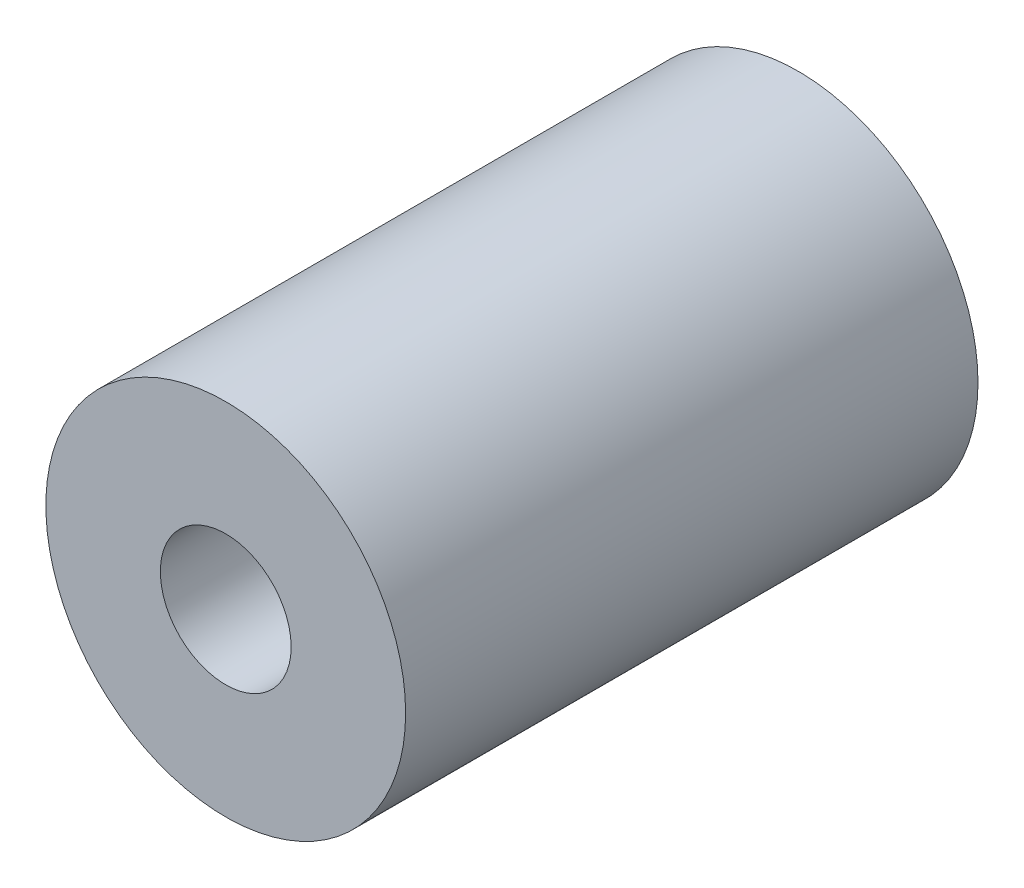
ISO-10303-21;
HEADER;
FILE_DESCRIPTION(('STEP AP214'),'2;1');
FILE_NAME('part.step','',(''),(''),'','','');
FILE_SCHEMA(('AUTOMOTIVE_DESIGN { 1 0 10303 214 1 1 1 1 }'));
ENDSEC;
DATA;
#1=APPLICATION_CONTEXT('core data for automotive mechanical design processes');
#2=APPLICATION_PROTOCOL_DEFINITION('international standard','automotive_design',2000,#1);
#3=PRODUCT_CONTEXT('',#1,'mechanical');
#4=PRODUCT('Part','Part','',(#3));
#5=PRODUCT_RELATED_PRODUCT_CATEGORY('part','',(#4));
#6=PRODUCT_DEFINITION_FORMATION('','',#4);
#7=PRODUCT_DEFINITION_CONTEXT('part definition',#1,'design');
#8=PRODUCT_DEFINITION('design','',#6,#7);
#9=PRODUCT_DEFINITION_SHAPE('','',#8);
#10=(LENGTH_UNIT() NAMED_UNIT(*) SI_UNIT(.MILLI.,.METRE.));
#11=(NAMED_UNIT(*) PLANE_ANGLE_UNIT() SI_UNIT($,.RADIAN.));
#12=(NAMED_UNIT(*) SI_UNIT($,.STERADIAN.) SOLID_ANGLE_UNIT());
#13=UNCERTAINTY_MEASURE_WITH_UNIT(LENGTH_MEASURE(1.E-05),#10,'distance_accuracy_value','');
#14=(GEOMETRIC_REPRESENTATION_CONTEXT(3) GLOBAL_UNCERTAINTY_ASSIGNED_CONTEXT((#13)) GLOBAL_UNIT_ASSIGNED_CONTEXT((#10,
#11,#12)) REPRESENTATION_CONTEXT('',''));
#15=CARTESIAN_POINT('',(0.,0.,0.));
#16=DIRECTION('',(0.,0.,1.));
#17=DIRECTION('',(1.,0.,0.));
#18=AXIS2_PLACEMENT_3D('',#15,#16,#17);
#19=CARTESIAN_POINT('',(0.,0.,35.));
#20=DIRECTION('',(0.,0.,-1.));
#21=DIRECTION('',(-1.,0.,0.));
#22=AXIS2_PLACEMENT_3D('',#19,#20,#21);
#23=CYLINDRICAL_SURFACE('',#22,11.);
#24=CARTESIAN_POINT('',(0.,-11.,30.0344309503601));
#25=CARTESIAN_POINT('',(0.111357271644373,-10.9999980072786,30.0344266316994));
#26=CARTESIAN_POINT('',(0.222771449918202,-10.9982915273343,30.0250991928774));
#27=CARTESIAN_POINT('',(0.442464406848309,-10.99164847502,29.9880574843352));
#28=CARTESIAN_POINT('',(0.550740387266074,-10.9867091072254,29.9603273017787));
#29=CARTESIAN_POINT('',(0.760947572513748,-10.9741532323507,29.8873538206891));
#30=CARTESIAN_POINT('',(0.862884263930177,-10.9665390793192,29.8421259181703));
#31=CARTESIAN_POINT('',(1.0577120033845,-10.949466714983,29.7354836191683));
#32=CARTESIAN_POINT('',(1.15060386767905,-10.9400086703132,29.6740706851719));
#33=CARTESIAN_POINT('',(1.32576444051238,-10.9201743349983,29.5360650407174));
#34=CARTESIAN_POINT('',(1.40791622603346,-10.9097897259708,29.4593251083793));
#35=CARTESIAN_POINT('',(1.55825357341079,-10.8893349521181,29.2931605962702));
#36=CARTESIAN_POINT('',(1.62643816794977,-10.8792648091126,29.2037351386709));
#37=CARTESIAN_POINT('',(1.74738695016477,-10.8604984020977,29.0139182209003));
#38=CARTESIAN_POINT('',(1.80003313265556,-10.851812871101,28.9134504151297));
#39=CARTESIAN_POINT('',(1.88765546949978,-10.836915832769,28.7049123000361));
#40=CARTESIAN_POINT('',(1.92263305283275,-10.8307041253674,28.596842606335));
#41=CARTESIAN_POINT('',(1.97355197711315,-10.8215415351671,28.3774163010035));
#42=CARTESIAN_POINT('',(1.98969666425445,-10.8185558462234,28.2661083586505));
#43=CARTESIAN_POINT('',(2.00312248736688,-10.8160783143231,28.0423265430455));
#44=CARTESIAN_POINT('',(2.00040521296643,-10.8165861769405,27.929852768844));
#45=CARTESIAN_POINT('',(1.97634934427,-10.8210066504918,27.7083990362271));
#46=CARTESIAN_POINT('',(1.95524117699072,-10.8248771281426,27.5993930824644));
#47=CARTESIAN_POINT('',(1.89536523340027,-10.8355206127391,27.3864959319929));
#48=CARTESIAN_POINT('',(1.85659674743188,-10.8422937363232,27.2826049410083));
#49=CARTESIAN_POINT('',(1.76227297789296,-10.8580238155271,27.0822081595813));
#50=CARTESIAN_POINT('',(1.7066239037154,-10.8669929171435,26.985747507694));
#51=CARTESIAN_POINT('',(1.58018503374043,-10.8860962201172,26.8034462134148));
#52=CARTESIAN_POINT('',(1.50939379023585,-10.8962305328347,26.7176065877138));
#53=CARTESIAN_POINT('',(1.35343399418352,-10.9167064080854,26.5576519539157));
#54=CARTESIAN_POINT('',(1.2680681726569,-10.9270488181647,26.4837292619232));
#55=CARTESIAN_POINT('',(1.08604454069331,-10.9466375043709,26.3512258168792));
#56=CARTESIAN_POINT('',(0.989386629498159,-10.9558837707156,26.2926452007388));
#57=CARTESIAN_POINT('',(0.787327598497298,-10.9722553782534,26.192463560575));
#58=CARTESIAN_POINT('',(0.681916780395493,-10.9793783255922,26.1508816816641));
#59=CARTESIAN_POINT('',(0.465448414462666,-10.9906820547088,26.0860677578664));
#60=CARTESIAN_POINT('',(0.354391431316064,-10.994863130091,26.0628338817862));
#61=CARTESIAN_POINT('',(0.131438649578499,-10.9997719337866,26.035641188441));
#62=CARTESIAN_POINT('',(0.0195760121089342,-11.0005468934114,26.031418726906));
#63=CARTESIAN_POINT('',(-0.203257238970967,-10.998686302475,26.0416627485416));
#64=CARTESIAN_POINT('',(-0.314227893453081,-10.9960509090871,26.0561283704318));
#65=CARTESIAN_POINT('',(-0.531297097592757,-10.9876950863245,26.1031186999219));
#66=CARTESIAN_POINT('',(-0.637425297458317,-10.9819973157216,26.1355108195429));
#67=CARTESIAN_POINT('',(-0.84274471375661,-10.9681529512222,26.217291778882));
#68=CARTESIAN_POINT('',(-0.941935480960949,-10.9600061989243,26.2666817180578));
#69=CARTESIAN_POINT('',(-1.13169524707493,-10.9420497958484,26.381645588163));
#70=CARTESIAN_POINT('',(-1.22216445208488,-10.932223816146,26.447381637516));
#71=CARTESIAN_POINT('',(-1.39088213822347,-10.9120428807108,26.5929513270312));
#72=CARTESIAN_POINT('',(-1.46912954974332,-10.901687878785,26.672786199772));
#73=CARTESIAN_POINT('',(-1.6121773788768,-10.8814603955764,26.8454778318086));
#74=CARTESIAN_POINT('',(-1.67679836741418,-10.8715955212189,26.9384842568859));
#75=CARTESIAN_POINT('',(-1.78949986552014,-10.8536151008102,27.1341871317666));
#76=CARTESIAN_POINT('',(-1.83758096630795,-10.8454994922354,27.2368832350445));
#77=CARTESIAN_POINT('',(-1.91557945241746,-10.8319954461548,27.4485817000518));
#78=CARTESIAN_POINT('',(-1.9455810786184,-10.8265943801675,27.5575521810981));
#79=CARTESIAN_POINT('',(-1.98683040178554,-10.8191012654539,27.7790939389911));
#80=CARTESIAN_POINT('',(-1.99808007453629,-10.8170088681136,27.891664835209));
#81=CARTESIAN_POINT('',(-2.00144313663184,-10.8163869388262,28.1154163258237));
#82=CARTESIAN_POINT('',(-1.99383937001232,-10.8178047454411,28.2265926217986));
#83=CARTESIAN_POINT('',(-1.96032846912815,-10.8239270874703,28.4460545883775));
#84=CARTESIAN_POINT('',(-1.93442142905718,-10.8286316059701,28.5543402738544));
#85=CARTESIAN_POINT('',(-1.86515567158477,-10.8407757208091,28.7648071477554));
#86=CARTESIAN_POINT('',(-1.82182581019232,-10.8482107929975,28.8669981105835));
#87=CARTESIAN_POINT('',(-1.71897473664823,-10.8649817751485,29.0627053975248));
#88=CARTESIAN_POINT('',(-1.65945247569007,-10.8743178082294,29.1562211592057));
#89=CARTESIAN_POINT('',(-1.52491543662799,-10.8940032465146,29.3333438249557));
#90=CARTESIAN_POINT('',(-1.44969415553099,-10.9043650783111,29.4167925202308));
#91=CARTESIAN_POINT('',(-1.28632651423364,-10.9248399206865,29.5699780313723));
#92=CARTESIAN_POINT('',(-1.19817718680093,-10.9349528735191,29.6397116907523));
#93=CARTESIAN_POINT('',(-1.0105711896463,-10.9538897429719,29.7640312474836));
#94=CARTESIAN_POINT('',(-0.911025849790497,-10.9627021317343,29.8184851355402));
#95=CARTESIAN_POINT('',(-0.704073905086345,-10.9779326099335,29.9098101664341));
#96=CARTESIAN_POINT('',(-0.59667492548667,-10.9843529858473,29.9466981096384));
#97=CARTESIAN_POINT('',(-0.407441749458405,-10.9927407037649,29.9942063806623));
#98=CARTESIAN_POINT('',(-0.32672542727649,-10.9954478027358,30.0092652833204));
#99=CARTESIAN_POINT('',(-0.164016342132203,-10.9990781643304,30.029379044155));
#100=CARTESIAN_POINT('',(-0.0820236084408332,-11.0000014678,30.0344341314018));
#101=CARTESIAN_POINT('',(0.,-11.,30.0344309503601));
#102=B_SPLINE_CURVE_WITH_KNOTS('',3,(#24,#25,#26,#27,#28,#29,#30,#31,#32,#33,#34,#35,#36,#37,
#38,#39,#40,#41,#42,#43,#44,#45,#46,#47,#48,#49,#50,#51,#52,#53,#54,#55,#56,#57,#58,#59,#60,#61,
#62,#63,#64,#65,#66,#67,#68,#69,#70,#71,#72,#73,#74,#75,#76,#77,#78,#79,#80,#81,#82,#83,#84,#85,
#86,#87,#88,#89,#90,#91,#92,#93,#94,#95,#96,#97,#98,#99,#100,#101),.UNSPECIFIED.,.T.,.F.,(4,2,2,
2,2,2,2,2,2,2,2,2,2,2,2,2,2,2,2,2,2,2,2,2,2,2,2,2,2,2,2,2,2,2,2,2,2,2,4),(0.,0.333771891552332,
0.66783277207259,1.00160038286675,1.3353378446015,1.67245014596885,2.00958578663078,
2.3492195220365,2.6888257845573,3.02473021172645,3.36060633024202,3.69233367290895,
4.02407434678871,4.35769306461625,4.69134369321255,5.02993210441872,5.36852353704646,
5.70749527023812,6.04643316861453,6.38065600997364,6.71486344850797,7.0466314328543,
7.37842088074221,7.71364226795666,8.04889297616123,8.38831506130459,8.72772501252475,
9.06554101076157,9.40332141303601,9.73606509730371,10.0688070691931,10.4010002025896,
10.733214857769,11.0701111453004,11.4070848782946,11.7468860454293,12.0863615649817,
12.3322171022956,12.5780670098676),.UNSPECIFIED.);
#103=CARTESIAN_POINT('',(0.,-11.,30.0344309503601));
#104=VERTEX_POINT('',#103);
#105=EDGE_CURVE('E58',#104,#104,#102,.T.);
#106=ORIENTED_EDGE('',*,*,#105,.T.);
#107=EDGE_LOOP('',(#106));
#108=FACE_BOUND('',#107,.T.);
#109=CARTESIAN_POINT('',(0.,-11.,8.7636310761506));
#110=CARTESIAN_POINT('',(0.111357271644373,-10.9999980072786,8.76362675748993));
#111=CARTESIAN_POINT('',(0.222771449918202,-10.9982915273343,8.75429931866795));
#112=CARTESIAN_POINT('',(0.442464406848309,-10.99164847502,8.71725761012568));
#113=CARTESIAN_POINT('',(0.550740387266074,-10.9867091072254,8.68952742756923));
#114=CARTESIAN_POINT('',(0.760947572513747,-10.9741532323507,8.61655394647962));
#115=CARTESIAN_POINT('',(0.862884263930176,-10.9665390793192,8.57132604396084));
#116=CARTESIAN_POINT('',(1.0577120033845,-10.949466714983,8.46468374495882));
#117=CARTESIAN_POINT('',(1.15060386767904,-10.9400086703132,8.40327081096241));
#118=CARTESIAN_POINT('',(1.32576444051238,-10.9201743349983,8.2652651665079));
#119=CARTESIAN_POINT('',(1.40791622603346,-10.9097897259708,8.18852523416984));
#120=CARTESIAN_POINT('',(1.55825357341079,-10.8893349521181,8.02236072206078));
#121=CARTESIAN_POINT('',(1.62643816794977,-10.8792648091126,7.93293526446146));
#122=CARTESIAN_POINT('',(1.74738695016477,-10.8604984020977,7.74311834669083));
#123=CARTESIAN_POINT('',(1.80003313265556,-10.851812871101,7.64265054092023));
#124=CARTESIAN_POINT('',(1.88765546949978,-10.836915832769,7.43411242582664));
#125=CARTESIAN_POINT('',(1.92263305283275,-10.8307041253674,7.32604273212557));
#126=CARTESIAN_POINT('',(1.97355197711315,-10.8215415351671,7.10661642679401));
#127=CARTESIAN_POINT('',(1.98969666425445,-10.8185558462234,6.99530848444098));
#128=CARTESIAN_POINT('',(2.00312248736688,-10.8160783143231,6.77152666883604));
#129=CARTESIAN_POINT('',(2.00040521296643,-10.8165861769405,6.65905289463457));
#130=CARTESIAN_POINT('',(1.97634934427,-10.8210066504918,6.43759916201759));
#131=CARTESIAN_POINT('',(1.95524117699072,-10.8248771281426,6.32859320825488));
#132=CARTESIAN_POINT('',(1.89536523340026,-10.8355206127391,6.11569605778344));
#133=CARTESIAN_POINT('',(1.85659674743188,-10.8422937363232,6.01180506679882));
#134=CARTESIAN_POINT('',(1.76227297789295,-10.8580238155272,5.81140828537187));
#135=CARTESIAN_POINT('',(1.7066239037154,-10.8669929171435,5.71494763348448));
#136=CARTESIAN_POINT('',(1.58018503374043,-10.8860962201172,5.53264633920531));
#137=CARTESIAN_POINT('',(1.50939379023584,-10.8962305328347,5.44680671350437));
#138=CARTESIAN_POINT('',(1.35343399418352,-10.9167064080854,5.28685207970623));
#139=CARTESIAN_POINT('',(1.2680681726569,-10.9270488181647,5.21292938771369));
#140=CARTESIAN_POINT('',(1.08604454069331,-10.9466375043709,5.08042594266977));
#141=CARTESIAN_POINT('',(0.989386629498158,-10.9558837707156,5.02184532652934));
#142=CARTESIAN_POINT('',(0.787327598497297,-10.9722553782534,4.92166368636558));
#143=CARTESIAN_POINT('',(0.681916780395493,-10.9793783255922,4.88008180745463));
#144=CARTESIAN_POINT('',(0.465448414462668,-10.9906820547088,4.8152678836569));
#145=CARTESIAN_POINT('',(0.354391431316066,-10.994863130091,4.79203400757669));
#146=CARTESIAN_POINT('',(0.1314386495785,-10.9997719337866,4.76484131423148));
#147=CARTESIAN_POINT('',(0.019576012108935,-11.0005468934114,4.76061885269652));
#148=CARTESIAN_POINT('',(-0.203257238970966,-10.998686302475,4.7708628743321));
#149=CARTESIAN_POINT('',(-0.314227893453081,-10.9960509090871,4.78532849622235));
#150=CARTESIAN_POINT('',(-0.531297097592756,-10.9876950863245,4.83231882571248));
#151=CARTESIAN_POINT('',(-0.637425297458316,-10.9819973157216,4.86471094533343));
#152=CARTESIAN_POINT('',(-0.842744713756609,-10.9681529512222,4.94649190467254));
#153=CARTESIAN_POINT('',(-0.941935480960948,-10.9600061989243,4.9958818438483));
#154=CARTESIAN_POINT('',(-1.13169524707493,-10.9420497958484,5.11084571395353));
#155=CARTESIAN_POINT('',(-1.22216445208488,-10.932223816146,5.17658176330653));
#156=CARTESIAN_POINT('',(-1.39088213822347,-10.9120428807108,5.3221514528217));
#157=CARTESIAN_POINT('',(-1.46912954974332,-10.901687878785,5.40198632556254));
#158=CARTESIAN_POINT('',(-1.6121773788768,-10.8814603955764,5.5746779575991));
#159=CARTESIAN_POINT('',(-1.67679836741418,-10.8715955212189,5.66768438267647));
#160=CARTESIAN_POINT('',(-1.78949986552014,-10.8536151008102,5.86338725755709));
#161=CARTESIAN_POINT('',(-1.83758096630795,-10.8454994922354,5.96608336083499));
#162=CARTESIAN_POINT('',(-1.91557945241746,-10.8319954461548,6.17778182584235));
#163=CARTESIAN_POINT('',(-1.9455810786184,-10.8265943801675,6.28675230688866));
#164=CARTESIAN_POINT('',(-1.98683040178554,-10.8191012654539,6.50829406478167));
#165=CARTESIAN_POINT('',(-1.99808007453629,-10.8170088681136,6.62086496099953));
#166=CARTESIAN_POINT('',(-2.00144313663184,-10.8163869388262,6.84461645161424));
#167=CARTESIAN_POINT('',(-1.99383937001232,-10.8178047454411,6.95579274758914));
#168=CARTESIAN_POINT('',(-1.96032846912815,-10.8239270874703,7.17525471416802));
#169=CARTESIAN_POINT('',(-1.93442142905718,-10.8286316059701,7.28354039964489));
#170=CARTESIAN_POINT('',(-1.86515567158476,-10.8407757208091,7.49400727354597));
#171=CARTESIAN_POINT('',(-1.82182581019232,-10.8482107929975,7.59619823637404));
#172=CARTESIAN_POINT('',(-1.71897473664823,-10.8649817751485,7.79190552331534));
#173=CARTESIAN_POINT('',(-1.65945247569007,-10.8743178082294,7.88542128499619));
#174=CARTESIAN_POINT('',(-1.52491543662799,-10.8940032465146,8.06254395074623));
#175=CARTESIAN_POINT('',(-1.44969415553099,-10.9043650783111,8.14599264602137));
#176=CARTESIAN_POINT('',(-1.28632651423364,-10.9248399206865,8.2991781571628));
#177=CARTESIAN_POINT('',(-1.19817718680093,-10.9349528735191,8.36891181654285));
#178=CARTESIAN_POINT('',(-1.0105711896463,-10.9538897429719,8.49323137327409));
#179=CARTESIAN_POINT('',(-0.911025849790496,-10.9627021317343,8.54768526133073));
#180=CARTESIAN_POINT('',(-0.704073905086344,-10.9779326099335,8.63901029222466));
#181=CARTESIAN_POINT('',(-0.59667492548667,-10.9843529858473,8.67589823542892));
#182=CARTESIAN_POINT('',(-0.407441749458405,-10.9927407037649,8.7234065064528));
#183=CARTESIAN_POINT('',(-0.326725427276489,-10.9954478027358,8.73846540911096));
#184=CARTESIAN_POINT('',(-0.164016342132202,-10.9990781643304,8.7585791699455));
#185=CARTESIAN_POINT('',(-0.0820236084408327,-11.0000014678,8.76363425719237));
#186=CARTESIAN_POINT('',(0.,-11.,8.7636310761506));
#187=B_SPLINE_CURVE_WITH_KNOTS('',3,(#109,#110,#111,#112,#113,#114,#115,#116,#117,#118,#119,
#120,#121,#122,#123,#124,#125,#126,#127,#128,#129,#130,#131,#132,#133,#134,#135,#136,#137,#138,
#139,#140,#141,#142,#143,#144,#145,#146,#147,#148,#149,#150,#151,#152,#153,#154,#155,#156,#157,
#158,#159,#160,#161,#162,#163,#164,#165,#166,#167,#168,#169,#170,#171,#172,#173,#174,#175,#176,
#177,#178,#179,#180,#181,#182,#183,#184,#185,#186),.UNSPECIFIED.,.T.,.F.,(4,2,2,2,2,2,2,2,2,2,2,
2,2,2,2,2,2,2,2,2,2,2,2,2,2,2,2,2,2,2,2,2,2,2,2,2,2,2,4),(0.,0.333771891552332,
0.667832772072589,1.00160038286674,1.3353378446015,1.67245014596885,2.00958578663078,
2.3492195220365,2.6888257845573,3.02473021172645,3.36060633024202,3.69233367290895,
4.02407434678871,4.35769306461625,4.69134369321255,5.02993210441872,5.36852353704646,
5.70749527023812,6.04643316861453,6.38065600997364,6.71486344850797,7.0466314328543,
7.3784208807422,7.71364226795666,8.04889297616123,8.38831506130459,8.72772501252475,
9.06554101076157,9.40332141303602,9.73606509730371,10.0688070691931,10.4010002025896,
10.733214857769,11.0701111453004,11.4070848782946,11.7468860454293,12.0863615649817,
12.3322171022956,12.5780670098676),.UNSPECIFIED.);
#188=CARTESIAN_POINT('',(0.,-11.,8.7636310761506));
#189=VERTEX_POINT('',#188);
#190=EDGE_CURVE('E57',#189,#189,#187,.T.);
#191=ORIENTED_EDGE('',*,*,#190,.T.);
#192=EDGE_LOOP('',(#191));
#193=FACE_BOUND('',#192,.T.);
#194=CARTESIAN_POINT('',(0.,0.,35.));
#195=DIRECTION('',(0.,0.,1.));
#196=DIRECTION('',(1.,0.,0.));
#197=AXIS2_PLACEMENT_3D('',#194,#195,#196);
#198=CIRCLE('',#197,11.);
#199=CARTESIAN_POINT('',(11.,0.,35.));
#200=VERTEX_POINT('',#199);
#201=EDGE_CURVE('E10',#200,#200,#198,.T.);
#202=ORIENTED_EDGE('',*,*,#201,.F.);
#203=EDGE_LOOP('',(#202));
#204=FACE_BOUND('',#203,.T.);
#205=CARTESIAN_POINT('',(0.,0.,0.));
#206=DIRECTION('',(0.,0.,1.));
#207=DIRECTION('',(1.,0.,0.));
#208=AXIS2_PLACEMENT_3D('',#205,#206,#207);
#209=CIRCLE('',#208,11.);
#210=CARTESIAN_POINT('',(11.,0.,0.));
#211=VERTEX_POINT('',#210);
#212=EDGE_CURVE('E42',#211,#211,#209,.T.);
#213=ORIENTED_EDGE('',*,*,#212,.T.);
#214=EDGE_LOOP('',(#213));
#215=FACE_BOUND('',#214,.T.);
#216=ADVANCED_FACE('F30',(#108,#193,#204,#215),#23,.T.);
#217=CARTESIAN_POINT('',(0.,0.,35.));
#218=DIRECTION('',(0.,0.,1.));
#219=DIRECTION('',(1.,0.,0.));
#220=AXIS2_PLACEMENT_3D('',#217,#218,#219);
#221=PLANE('',#220);
#222=CARTESIAN_POINT('',(0.,0.,35.));
#223=DIRECTION('',(0.,0.,1.));
#224=DIRECTION('',(1.,0.,0.));
#225=AXIS2_PLACEMENT_3D('',#222,#223,#224);
#226=CIRCLE('',#225,4.);
#227=CARTESIAN_POINT('',(4.,0.,35.));
#228=VERTEX_POINT('',#227);
#229=EDGE_CURVE('E50',#228,#228,#226,.T.);
#230=ORIENTED_EDGE('',*,*,#229,.F.);
#231=EDGE_LOOP('',(#230));
#232=FACE_BOUND('',#231,.T.);
#233=ORIENTED_EDGE('',*,*,#201,.T.);
#234=EDGE_LOOP('',(#233));
#235=FACE_BOUND('',#234,.T.);
#236=ADVANCED_FACE('F83',(#232,#235),#221,.T.);
#237=CARTESIAN_POINT('',(0.,0.,0.));
#238=DIRECTION('',(0.,0.,1.));
#239=DIRECTION('',(1.,0.,0.));
#240=AXIS2_PLACEMENT_3D('',#237,#238,#239);
#241=PLANE('',#240);
#242=CARTESIAN_POINT('',(0.,0.,0.));
#243=DIRECTION('',(0.,0.,1.));
#244=DIRECTION('',(1.,0.,0.));
#245=AXIS2_PLACEMENT_3D('',#242,#243,#244);
#246=CIRCLE('',#245,4.);
#247=CARTESIAN_POINT('',(4.,0.,0.));
#248=VERTEX_POINT('',#247);
#249=EDGE_CURVE('E47',#248,#248,#246,.T.);
#250=ORIENTED_EDGE('',*,*,#249,.T.);
#251=EDGE_LOOP('',(#250));
#252=FACE_BOUND('',#251,.T.);
#253=ORIENTED_EDGE('',*,*,#212,.F.);
#254=EDGE_LOOP('',(#253));
#255=FACE_BOUND('',#254,.T.);
#256=ADVANCED_FACE('F85',(#252,#255),#241,.F.);
#257=CARTESIAN_POINT('',(0.,0.,0.));
#258=DIRECTION('',(0.,0.,1.));
#259=DIRECTION('',(1.,0.,0.));
#260=AXIS2_PLACEMENT_3D('',#257,#258,#259);
#261=CYLINDRICAL_SURFACE('',#260,4.);
#262=CARTESIAN_POINT('',(0.,-4.,30.0344309503601));
#263=CARTESIAN_POINT('',(-0.105143925902467,-3.99999426810082,30.0344243457257));
#264=CARTESIAN_POINT('',(-0.210413199395125,-3.99580982039513,30.026090804118));
#265=CARTESIAN_POINT('',(-0.417840470537792,-3.97948312074314,29.993125189677));
#266=CARTESIAN_POINT('',(-0.519992173427259,-3.96732575657839,29.9684621643644));
#267=CARTESIAN_POINT('',(-0.717867089760898,-3.93632558806751,29.9040433331268));
#268=CARTESIAN_POINT('',(-0.813613605878293,-3.91750878355075,29.8643461818641));
#269=CARTESIAN_POINT('',(-0.996945233613198,-3.87491553031523,29.7712897076301));
#270=CARTESIAN_POINT('',(-1.08453098798012,-3.8511394726705,29.7179314618623));
#271=CARTESIAN_POINT('',(-1.25501563552382,-3.79912516516124,29.5953964513895));
#272=CARTESIAN_POINT('',(-1.33731042224422,-3.77070398255074,29.5254579918808));
#273=CARTESIAN_POINT('',(-1.48955888973396,-3.71319940493486,29.373387991866));
#274=CARTESIAN_POINT('',(-1.55950316621354,-3.68411552418069,29.2912472468152));
#275=CARTESIAN_POINT('',(-1.69050400090056,-3.62597902394695,29.1094642513133));
#276=CARTESIAN_POINT('',(-1.75045067110327,-3.59710373940264,29.0089587536682));
#277=CARTESIAN_POINT('',(-1.85233645378139,-3.54571957544641,28.7976962783876));
#278=CARTESIAN_POINT('',(-1.89428842993267,-3.52320615213979,28.6869466929146));
#279=CARTESIAN_POINT('',(-1.95626488437718,-3.48915734075617,28.4651007395162));
#280=CARTESIAN_POINT('',(-1.97745171416088,-3.47704543167427,28.3544220462253));
#281=CARTESIAN_POINT('',(-2.00085398661769,-3.46363779897055,28.1304732748011));
#282=CARTESIAN_POINT('',(-2.00308817674615,-3.46233138686576,28.0172058686178));
#283=CARTESIAN_POINT('',(-1.98937457434459,-3.47021860514497,27.8058589017293));
#284=CARTESIAN_POINT('',(-1.97556911907364,-3.47817527324027,27.707582887914));
#285=CARTESIAN_POINT('',(-1.93387969811387,-3.501524574677,27.514987131614));
#286=CARTESIAN_POINT('',(-1.9059912477953,-3.51691957663553,27.4206686597494));
#287=CARTESIAN_POINT('',(-1.83641956077201,-3.55374952825482,27.2359726852288));
#288=CARTESIAN_POINT('',(-1.79443013423199,-3.57531681327997,27.1457381527885));
#289=CARTESIAN_POINT('',(-1.698083375336,-3.62206808562807,26.9731623651801));
#290=CARTESIAN_POINT('',(-1.64372048762494,-3.64725369560381,26.8908246791599));
#291=CARTESIAN_POINT('',(-1.51613210982558,-3.70226315806572,26.7253884448736));
#292=CARTESIAN_POINT('',(-1.44138891673856,-3.73227020473492,26.6435172032078));
#293=CARTESIAN_POINT('',(-1.27911115748275,-3.79095246600814,26.4929601131783));
#294=CARTESIAN_POINT('',(-1.19157051314857,-3.81962703917602,26.4242805662923));
#295=CARTESIAN_POINT('',(-1.0010330116637,-3.87403974565928,26.2990596283006));
#296=CARTESIAN_POINT('',(-0.897507183198816,-3.89957968324015,26.2432300054686));
#297=CARTESIAN_POINT('',(-0.680932430977591,-3.94315762242485,26.1502368922741));
#298=CARTESIAN_POINT('',(-0.56789115253055,-3.96120157887106,26.1130585803297));
#299=CARTESIAN_POINT('',(-0.345532983321403,-3.98648667482871,26.0614801429267));
#300=CARTESIAN_POINT('',(-0.236683061096651,-3.9944987660262,26.0454484788665));
#301=CARTESIAN_POINT('',(-0.0175591998987028,-4.00146026918207,26.0315014880911));
#302=CARTESIAN_POINT('',(0.0927140397398178,-4.00041397442637,26.0335775790811));
#303=CARTESIAN_POINT('',(0.302465943971975,-3.9898238450687,26.0548443271976));
#304=CARTESIAN_POINT('',(0.402118816099861,-3.98094491376337,26.0726960158201));
#305=CARTESIAN_POINT('',(0.596813784603883,-3.9564434262968,26.1229070941503));
#306=CARTESIAN_POINT('',(0.691855371382175,-3.94082012668824,26.1552680832671));
#307=CARTESIAN_POINT('',(0.877777216899145,-3.90368502827176,26.2344278832261));
#308=CARTESIAN_POINT('',(0.968460794011606,-3.88201763539261,26.2816130505926));
#309=CARTESIAN_POINT('',(1.14092272339854,-3.83487948634835,26.3886460216532));
#310=CARTESIAN_POINT('',(1.22269725955318,-3.80940711133877,26.4484992195509));
#311=CARTESIAN_POINT('',(1.38353537857843,-3.75416442672396,26.5859518010215));
#312=CARTESIAN_POINT('',(1.46154415563805,-3.72421769686998,26.6647166872504));
#313=CARTESIAN_POINT('',(1.60371264223771,-3.6652478321764,26.8342812529155));
#314=CARTESIAN_POINT('',(1.66786277142375,-3.63622534800094,26.9250891880559));
#315=CARTESIAN_POINT('',(1.78341582895804,-3.58102384412979,27.121718258706));
#316=CARTESIAN_POINT('',(1.8340509916005,-3.55505059178121,27.228053482549));
#317=CARTESIAN_POINT('',(1.91616565186941,-3.51148144588269,27.44945108551));
#318=CARTESIAN_POINT('',(1.94766983173403,-3.493874764435,27.5645020032939));
#319=CARTESIAN_POINT('',(1.98772337493374,-3.47123002051604,27.7882513961295));
#320=CARTESIAN_POINT('',(1.9981859928109,-3.4651476693013,27.8964994572306));
#321=CARTESIAN_POINT('',(2.0013783087524,-3.46330709283206,28.1133250846891));
#322=CARTESIAN_POINT('',(1.99411569324648,-3.4675443925278,28.2219024878358));
#323=CARTESIAN_POINT('',(1.96385225118662,-3.48475724102153,28.4253979534269));
#324=CARTESIAN_POINT('',(1.94241662868607,-3.49686188965317,28.5206318906496));
#325=CARTESIAN_POINT('',(1.88635071644882,-3.52742032375305,28.7060471892088));
#326=CARTESIAN_POINT('',(1.85171618231984,-3.54587615139337,28.7962269145441));
#327=CARTESIAN_POINT('',(1.76763149060113,-3.58857060729071,28.9756806523331));
#328=CARTESIAN_POINT('',(1.7173422756314,-3.61311444791841,29.0644867540181));
#329=CARTESIAN_POINT('',(1.60430194327478,-3.66470663269721,29.2329800227226));
#330=CARTESIAN_POINT('',(1.54154434248312,-3.69175627591221,29.3126624114023));
#331=CARTESIAN_POINT('',(1.39640665332275,-3.74924646316184,29.4707149150694));
#332=CARTESIAN_POINT('',(1.31256884599452,-3.77969966613256,29.5477491550607));
#333=CARTESIAN_POINT('',(1.13230961246639,-3.83755504519861,29.6869569172306));
#334=CARTESIAN_POINT('',(1.03588144661039,-3.8649555725239,29.7491224292999));
#335=CARTESIAN_POINT('',(0.831863193565889,-3.91396019133075,29.8569036757842));
#336=CARTESIAN_POINT('',(0.724199007553459,-3.93552192987866,29.902399288833));
#337=CARTESIAN_POINT('',(0.501484202276172,-3.97002682597974,29.9740472858749));
#338=CARTESIAN_POINT('',(0.386455599178201,-3.98299446726136,30.0002546439715));
#339=CARTESIAN_POINT('',(0.225203892981792,-3.99390923826956,30.0222257725316));
#340=CARTESIAN_POINT('',(0.18032375888313,-3.99618730680502,30.0267962320928));
#341=CARTESIAN_POINT('',(0.0903034636101832,-3.99923393953631,30.0329002813882));
#342=CARTESIAN_POINT('',(0.0451632952932569,-4.00000246206762,30.0344337873005));
#343=CARTESIAN_POINT('',(0.,-4.,30.0344309503601));
#344=B_SPLINE_CURVE_WITH_KNOTS('',3,(#262,#263,#264,#265,#266,#267,#268,#269,#270,#271,#272,
#273,#274,#275,#276,#277,#278,#279,#280,#281,#282,#283,#284,#285,#286,#287,#288,#289,#290,#291,
#292,#293,#294,#295,#296,#297,#298,#299,#300,#301,#302,#303,#304,#305,#306,#307,#308,#309,#310,
#311,#312,#313,#314,#315,#316,#317,#318,#319,#320,#321,#322,#323,#324,#325,#326,#327,#328,#329,
#330,#331,#332,#333,#334,#335,#336,#337,#338,#339,#340,#341,#342,#343),.UNSPECIFIED.,.T.,.F.,(4,
2,2,2,2,2,2,2,2,2,2,2,2,2,2,2,2,2,2,2,2,2,2,2,2,2,2,2,2,2,2,2,2,2,2,2,2,2,2,2,4),(0.,
0.315248514840585,0.631096299418396,0.945724310984597,1.26032752116314,1.59396351743618,
1.92785247530807,2.28763452861505,2.64715895796562,2.98516024280459,3.32282714658041,
3.62011424818641,3.91749607851357,4.22180480336975,4.52625042520444,4.86929882667757,
5.21251069197373,5.57166044428882,5.93052433824559,6.25966580942691,6.58865129022952,
6.89213813012244,7.19565843261863,7.50785712055797,7.82018901496679,8.16319221288838,
8.50643177230864,8.86629364323451,9.22569023890902,9.55058615006093,9.87534119729357,
10.1691586049771,10.463070575767,10.7767291356058,11.0905512228726,11.4425048551434,
11.7946476676249,12.1492802732705,12.502898172423,12.6383056026783,12.7737167702213),.UNSPECIFIED.);
#345=CARTESIAN_POINT('',(0.,-4.,30.0344309503601));
#346=VERTEX_POINT('',#345);
#347=EDGE_CURVE('E34',#346,#346,#344,.T.);
#348=ORIENTED_EDGE('',*,*,#347,.T.);
#349=EDGE_LOOP('',(#348));
#350=FACE_BOUND('',#349,.T.);
#351=CARTESIAN_POINT('',(0.,-4.,8.7636310761506));
#352=CARTESIAN_POINT('',(-0.105143925902467,-3.99999426810082,8.76362447151622));
#353=CARTESIAN_POINT('',(-0.210413199395125,-3.99580982039513,8.75529092990849));
#354=CARTESIAN_POINT('',(-0.417840470537792,-3.97948312074314,8.72232531546753));
#355=CARTESIAN_POINT('',(-0.519992173427259,-3.96732575657839,8.69766229015497));
#356=CARTESIAN_POINT('',(-0.717867089760898,-3.93632558806751,8.63324345891735));
#357=CARTESIAN_POINT('',(-0.813613605878292,-3.91750878355075,8.59354630765467));
#358=CARTESIAN_POINT('',(-0.996945233613197,-3.87491553031523,8.50048983342063));
#359=CARTESIAN_POINT('',(-1.08453098798012,-3.85113947267051,8.44713158765287));
#360=CARTESIAN_POINT('',(-1.25501563552382,-3.79912516516124,8.32459657718003));
#361=CARTESIAN_POINT('',(-1.33731042224422,-3.77070398255074,8.25465811767133));
#362=CARTESIAN_POINT('',(-1.48955888973396,-3.71319940493486,8.10258811765653));
#363=CARTESIAN_POINT('',(-1.55950316621353,-3.68411552418069,8.02044737260572));
#364=CARTESIAN_POINT('',(-1.69050400090056,-3.62597902394695,7.83866437710384));
#365=CARTESIAN_POINT('',(-1.75045067110327,-3.59710373940264,7.73815887945878));
#366=CARTESIAN_POINT('',(-1.85233645378139,-3.54571957544641,7.52689640417817));
#367=CARTESIAN_POINT('',(-1.89428842993267,-3.52320615213979,7.41614681870511));
#368=CARTESIAN_POINT('',(-1.95626488437718,-3.48915734075617,7.19430086530676));
#369=CARTESIAN_POINT('',(-1.97745171416088,-3.47704543167427,7.08362217201582));
#370=CARTESIAN_POINT('',(-2.00085398661769,-3.46363779897055,6.85967340059165));
#371=CARTESIAN_POINT('',(-2.00308817674615,-3.46233138686576,6.7464059944083));
#372=CARTESIAN_POINT('',(-1.98937457434459,-3.47021860514497,6.53505902751987));
#373=CARTESIAN_POINT('',(-1.97556911907364,-3.47817527324027,6.43678301370451));
#374=CARTESIAN_POINT('',(-1.93387969811387,-3.501524574677,6.24418725740452));
#375=CARTESIAN_POINT('',(-1.9059912477953,-3.51691957663553,6.14986878553997));
#376=CARTESIAN_POINT('',(-1.83641956077201,-3.55374952825482,5.96517281101929));
#377=CARTESIAN_POINT('',(-1.79443013423199,-3.57531681327997,5.87493827857903));
#378=CARTESIAN_POINT('',(-1.69808337533601,-3.62206808562807,5.70236249097059));
#379=CARTESIAN_POINT('',(-1.64372048762494,-3.64725369560381,5.62002480495043));
#380=CARTESIAN_POINT('',(-1.51613210982558,-3.70226315806572,5.45458857066415));
#381=CARTESIAN_POINT('',(-1.44138891673856,-3.73227020473492,5.37271732899829));
#382=CARTESIAN_POINT('',(-1.27911115748275,-3.79095246600814,5.2221602389688));
#383=CARTESIAN_POINT('',(-1.19157051314857,-3.81962703917602,5.15348069208284));
#384=CARTESIAN_POINT('',(-1.0010330116637,-3.87403974565928,5.02825975409115));
#385=CARTESIAN_POINT('',(-0.897507183198819,-3.89957968324015,4.97243013125912));
#386=CARTESIAN_POINT('',(-0.680932430977594,-3.94315762242485,4.87943701806459));
#387=CARTESIAN_POINT('',(-0.567891152530553,-3.96120157887106,4.84225870612027));
#388=CARTESIAN_POINT('',(-0.345532983321405,-3.98648667482871,4.79068026871725));
#389=CARTESIAN_POINT('',(-0.236683061096653,-3.9944987660262,4.77464860465704));
#390=CARTESIAN_POINT('',(-0.017559199898704,-4.00146026918207,4.76070161388163));
#391=CARTESIAN_POINT('',(0.0927140397398166,-4.00041397442637,4.76277770487167));
#392=CARTESIAN_POINT('',(0.302465943971973,-3.9898238450687,4.78404445298809));
#393=CARTESIAN_POINT('',(0.402118816099859,-3.98094491376337,4.80189614161059));
#394=CARTESIAN_POINT('',(0.596813784603881,-3.95644342629681,4.85210721994085));
#395=CARTESIAN_POINT('',(0.691855371382173,-3.94082012668824,4.88446820905759));
#396=CARTESIAN_POINT('',(0.877777216899145,-3.90368502827176,4.96362800901667));
#397=CARTESIAN_POINT('',(0.968460794011606,-3.88201763539262,5.01081317638318));
#398=CARTESIAN_POINT('',(1.14092272339854,-3.83487948634835,5.11784614744374));
#399=CARTESIAN_POINT('',(1.22269725955318,-3.80940711133877,5.17769934534139));
#400=CARTESIAN_POINT('',(1.38353537857843,-3.75416442672396,5.31515192681204));
#401=CARTESIAN_POINT('',(1.46154415563805,-3.72421769686998,5.3939168130409));
#402=CARTESIAN_POINT('',(1.60371264223771,-3.6652478321764,5.56348137870606));
#403=CARTESIAN_POINT('',(1.66786277142375,-3.63622534800094,5.65428931384644));
#404=CARTESIAN_POINT('',(1.78341582895803,-3.58102384412979,5.85091838449655));
#405=CARTESIAN_POINT('',(1.8340509916005,-3.55505059178121,5.95725360833957));
#406=CARTESIAN_POINT('',(1.91616565186941,-3.51148144588269,6.17865121130054));
#407=CARTESIAN_POINT('',(1.94766983173403,-3.493874764435,6.29370212908438));
#408=CARTESIAN_POINT('',(1.98772337493374,-3.47123002051604,6.51745152192001));
#409=CARTESIAN_POINT('',(1.9981859928109,-3.4651476693013,6.62569958302109));
#410=CARTESIAN_POINT('',(2.0013783087524,-3.46330709283206,6.84252521047965));
#411=CARTESIAN_POINT('',(1.99411569324648,-3.4675443925278,6.95110261362633));
#412=CARTESIAN_POINT('',(1.96385225118662,-3.48475724102153,7.15459807921748));
#413=CARTESIAN_POINT('',(1.94241662868607,-3.49686188965317,7.24983201644008));
#414=CARTESIAN_POINT('',(1.88635071644882,-3.52742032375305,7.43524731499934));
#415=CARTESIAN_POINT('',(1.85171618231984,-3.54587615139337,7.52542704033467));
#416=CARTESIAN_POINT('',(1.76763149060113,-3.58857060729071,7.70488077812368));
#417=CARTESIAN_POINT('',(1.7173422756314,-3.61311444791841,7.79368687980866));
#418=CARTESIAN_POINT('',(1.60430194327479,-3.66470663269721,7.96218014851312));
#419=CARTESIAN_POINT('',(1.54154434248312,-3.69175627591221,8.04186253719283));
#420=CARTESIAN_POINT('',(1.39640665332275,-3.74924646316184,8.19991504085995));
#421=CARTESIAN_POINT('',(1.31256884599452,-3.77969966613256,8.27694928085118));
#422=CARTESIAN_POINT('',(1.1323096124664,-3.83755504519861,8.41615704302114));
#423=CARTESIAN_POINT('',(1.0358814466104,-3.8649555725239,8.47832255509042));
#424=CARTESIAN_POINT('',(0.831863193565893,-3.91396019133075,8.58610380157474));
#425=CARTESIAN_POINT('',(0.724199007553462,-3.93552192987866,8.63159941462354));
#426=CARTESIAN_POINT('',(0.501484202276174,-3.97002682597974,8.70324741166542));
#427=CARTESIAN_POINT('',(0.386455599178201,-3.98299446726136,8.72945476976203));
#428=CARTESIAN_POINT('',(0.225203892981791,-3.99390923826956,8.75142589832209));
#429=CARTESIAN_POINT('',(0.18032375888313,-3.99618730680502,8.75599635788329));
#430=CARTESIAN_POINT('',(0.0903034636101833,-3.99923393953631,8.76210040717877));
#431=CARTESIAN_POINT('',(0.045163295293257,-4.00000246206762,8.76363391309102));
#432=CARTESIAN_POINT('',(0.,-4.,8.7636310761506));
#433=B_SPLINE_CURVE_WITH_KNOTS('',3,(#351,#352,#353,#354,#355,#356,#357,#358,#359,#360,#361,
#362,#363,#364,#365,#366,#367,#368,#369,#370,#371,#372,#373,#374,#375,#376,#377,#378,#379,#380,
#381,#382,#383,#384,#385,#386,#387,#388,#389,#390,#391,#392,#393,#394,#395,#396,#397,#398,#399,
#400,#401,#402,#403,#404,#405,#406,#407,#408,#409,#410,#411,#412,#413,#414,#415,#416,#417,#418,
#419,#420,#421,#422,#423,#424,#425,#426,#427,#428,#429,#430,#431,#432),.UNSPECIFIED.,.T.,.F.,(4,
2,2,2,2,2,2,2,2,2,2,2,2,2,2,2,2,2,2,2,2,2,2,2,2,2,2,2,2,2,2,2,2,2,2,2,2,2,2,2,4),(0.,
0.315248514840585,0.631096299418395,0.945724310984596,1.26032752116314,1.59396351743618,
1.92785247530807,2.28763452861505,2.64715895796562,2.98516024280459,3.32282714658041,
3.62011424818641,3.91749607851357,4.22180480336974,4.52625042520444,4.86929882667757,
5.21251069197373,5.57166044428881,5.93052433824559,6.25966580942691,6.58865129022952,
6.89213813012244,7.19565843261863,7.50785712055797,7.82018901496678,8.16319221288838,
8.50643177230864,8.86629364323452,9.22569023890901,9.55058615006093,9.87534119729357,
10.1691586049771,10.463070575767,10.7767291356057,11.0905512228726,11.4425048551434,
11.7946476676249,12.1492802732705,12.502898172423,12.6383056026783,12.7737167702213),.UNSPECIFIED.);
#434=CARTESIAN_POINT('',(0.,-4.,8.7636310761506));
#435=VERTEX_POINT('',#434);
#436=EDGE_CURVE('E52',#435,#435,#433,.T.);
#437=ORIENTED_EDGE('',*,*,#436,.T.);
#438=EDGE_LOOP('',(#437));
#439=FACE_BOUND('',#438,.T.);
#440=ORIENTED_EDGE('',*,*,#249,.F.);
#441=EDGE_LOOP('',(#440));
#442=FACE_BOUND('',#441,.T.);
#443=ORIENTED_EDGE('',*,*,#229,.T.);
#444=EDGE_LOOP('',(#443));
#445=FACE_BOUND('',#444,.T.);
#446=ADVANCED_FACE('F59',(#350,#439,#442,#445),#261,.F.);
#447=CARTESIAN_POINT('',(0.,-35.,6.7636310761506));
#448=DIRECTION('',(0.,1.,0.));
#449=DIRECTION('',(0.,0.,1.));
#450=AXIS2_PLACEMENT_3D('',#447,#448,#449);
#451=CYLINDRICAL_SURFACE('',#450,2.);
#452=ORIENTED_EDGE('',*,*,#436,.F.);
#453=EDGE_LOOP('',(#452));
#454=FACE_BOUND('',#453,.T.);
#455=ORIENTED_EDGE('',*,*,#190,.F.);
#456=EDGE_LOOP('',(#455));
#457=FACE_BOUND('',#456,.T.);
#458=ADVANCED_FACE('F62',(#454,#457),#451,.F.);
#459=CARTESIAN_POINT('',(0.,-35.,28.0344309503601));
#460=DIRECTION('',(0.,1.,0.));
#461=DIRECTION('',(0.,0.,1.));
#462=AXIS2_PLACEMENT_3D('',#459,#460,#461);
#463=CYLINDRICAL_SURFACE('',#462,2.);
#464=ORIENTED_EDGE('',*,*,#347,.F.);
#465=EDGE_LOOP('',(#464));
#466=FACE_BOUND('',#465,.T.);
#467=ORIENTED_EDGE('',*,*,#105,.F.);
#468=EDGE_LOOP('',(#467));
#469=FACE_BOUND('',#468,.T.);
#470=ADVANCED_FACE('F65',(#466,#469),#463,.F.);
#471=CLOSED_SHELL('',(#216,#236,#256,#446,#458,#470));
#472=MANIFOLD_SOLID_BREP('B2',#471);
#473=ADVANCED_BREP_SHAPE_REPRESENTATION('',(#18,#472),#14);
#474=SHAPE_DEFINITION_REPRESENTATION(#9,#473);
ENDSEC;
END-ISO-10303-21;
